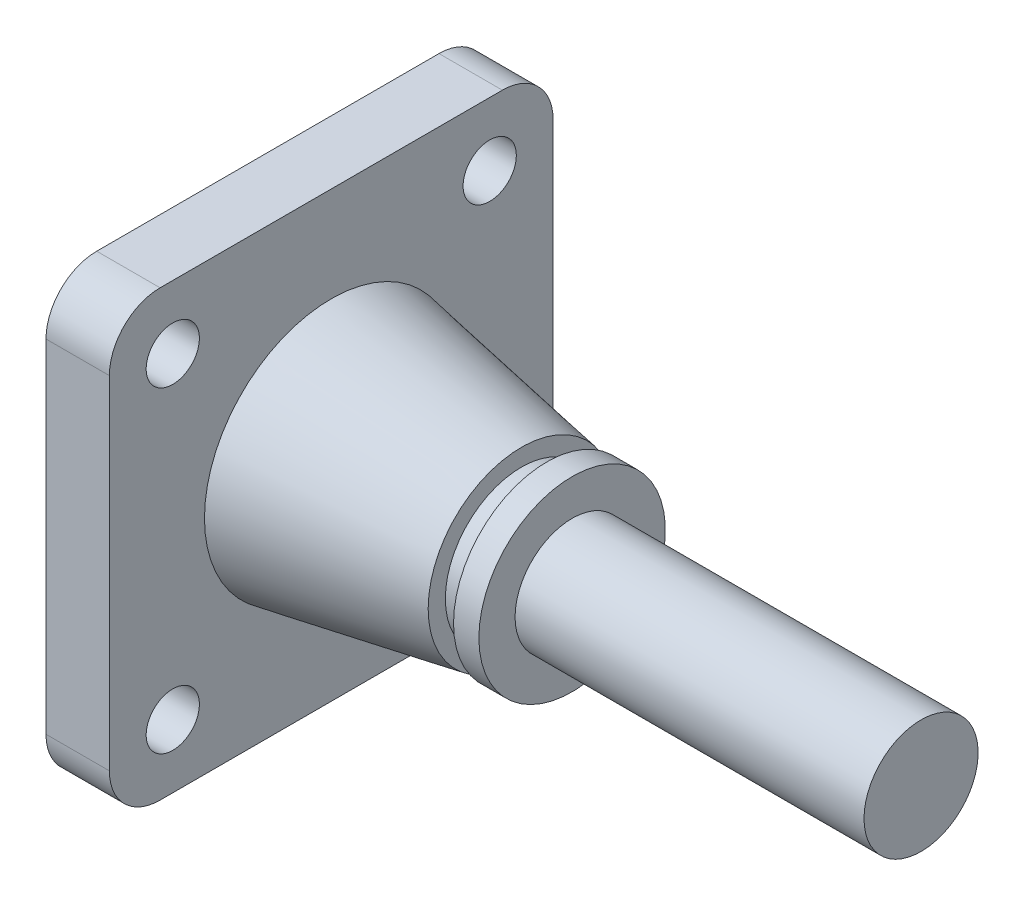
ISO-10303-21;
HEADER;
FILE_DESCRIPTION(('STEP AP214'),'2;1');
FILE_NAME('part.step','',(''),(''),'','','');
FILE_SCHEMA(('AUTOMOTIVE_DESIGN { 1 0 10303 214 1 1 1 1 }'));
ENDSEC;
DATA;
#1=APPLICATION_CONTEXT('core data for automotive mechanical design processes');
#2=APPLICATION_PROTOCOL_DEFINITION('international standard','automotive_design',2000,#1);
#3=PRODUCT_CONTEXT('',#1,'mechanical');
#4=PRODUCT('Part','Part','',(#3));
#5=PRODUCT_RELATED_PRODUCT_CATEGORY('part','',(#4));
#6=PRODUCT_DEFINITION_FORMATION('','',#4);
#7=PRODUCT_DEFINITION_CONTEXT('part definition',#1,'design');
#8=PRODUCT_DEFINITION('design','',#6,#7);
#9=PRODUCT_DEFINITION_SHAPE('','',#8);
#10=(LENGTH_UNIT() NAMED_UNIT(*) SI_UNIT(.MILLI.,.METRE.));
#11=(NAMED_UNIT(*) PLANE_ANGLE_UNIT() SI_UNIT($,.RADIAN.));
#12=(NAMED_UNIT(*) SI_UNIT($,.STERADIAN.) SOLID_ANGLE_UNIT());
#13=UNCERTAINTY_MEASURE_WITH_UNIT(LENGTH_MEASURE(1.E-05),#10,'distance_accuracy_value','');
#14=(GEOMETRIC_REPRESENTATION_CONTEXT(3) GLOBAL_UNCERTAINTY_ASSIGNED_CONTEXT((#13)) GLOBAL_UNIT_ASSIGNED_CONTEXT((#10,
#11,#12)) REPRESENTATION_CONTEXT('',''));
#15=CARTESIAN_POINT('',(0.,0.,0.));
#16=DIRECTION('',(0.,0.,1.));
#17=DIRECTION('',(1.,0.,0.));
#18=AXIS2_PLACEMENT_3D('',#15,#16,#17);
#19=CARTESIAN_POINT('',(5.,0.,-35.));
#20=DIRECTION('',(-1.,0.,0.));
#21=DIRECTION('',(0.,0.,1.));
#22=AXIS2_PLACEMENT_3D('',#19,#20,#21);
#23=PLANE('',#22);
#24=CARTESIAN_POINT('',(5.,-12.5,12.5));
#25=DIRECTION('',(-1.,0.,0.));
#26=DIRECTION('',(0.,0.,1.));
#27=AXIS2_PLACEMENT_3D('',#24,#25,#26);
#28=CIRCLE('',#27,2.1);
#29=CARTESIAN_POINT('',(5.,-12.5,14.6));
#30=VERTEX_POINT('',#29);
#31=EDGE_CURVE('E131',#30,#30,#28,.T.);
#32=ORIENTED_EDGE('',*,*,#31,.T.);
#33=EDGE_LOOP('',(#32));
#34=FACE_BOUND('',#33,.T.);
#35=CARTESIAN_POINT('',(5.,-12.5,-12.5));
#36=DIRECTION('',(-1.,0.,0.));
#37=DIRECTION('',(0.,0.,1.));
#38=AXIS2_PLACEMENT_3D('',#35,#36,#37);
#39=CIRCLE('',#38,2.1);
#40=CARTESIAN_POINT('',(5.,-12.5,-10.4));
#41=VERTEX_POINT('',#40);
#42=EDGE_CURVE('E289',#41,#41,#39,.T.);
#43=ORIENTED_EDGE('',*,*,#42,.T.);
#44=EDGE_LOOP('',(#43));
#45=FACE_BOUND('',#44,.T.);
#46=CARTESIAN_POINT('',(5.,12.5,-12.5));
#47=DIRECTION('',(-1.,0.,0.));
#48=DIRECTION('',(0.,0.,1.));
#49=AXIS2_PLACEMENT_3D('',#46,#47,#48);
#50=CIRCLE('',#49,2.1);
#51=CARTESIAN_POINT('',(5.,12.5,-10.4));
#52=VERTEX_POINT('',#51);
#53=EDGE_CURVE('E288',#52,#52,#50,.T.);
#54=ORIENTED_EDGE('',*,*,#53,.T.);
#55=EDGE_LOOP('',(#54));
#56=FACE_BOUND('',#55,.T.);
#57=CARTESIAN_POINT('',(5.,12.5,12.5));
#58=DIRECTION('',(-1.,0.,0.));
#59=DIRECTION('',(0.,0.,1.));
#60=AXIS2_PLACEMENT_3D('',#57,#58,#59);
#61=CIRCLE('',#60,2.1);
#62=CARTESIAN_POINT('',(5.,12.5,14.6));
#63=VERTEX_POINT('',#62);
#64=EDGE_CURVE('E291',#63,#63,#61,.T.);
#65=ORIENTED_EDGE('',*,*,#64,.T.);
#66=EDGE_LOOP('',(#65));
#67=FACE_BOUND('',#66,.T.);
#68=CARTESIAN_POINT('',(5.,0.,0.));
#69=DIRECTION('',(-1.,0.,0.));
#70=DIRECTION('',(0.,0.,1.));
#71=AXIS2_PLACEMENT_3D('',#68,#69,#70);
#72=CIRCLE('',#71,10.);
#73=CARTESIAN_POINT('',(5.,0.,10.));
#74=VERTEX_POINT('',#73);
#75=EDGE_CURVE('E137',#74,#74,#72,.T.);
#76=ORIENTED_EDGE('',*,*,#75,.T.);
#77=EDGE_LOOP('',(#76));
#78=FACE_BOUND('',#77,.T.);
#79=DIRECTION('',(0.,1.,0.));
#80=VECTOR('',#79,1.);
#81=CARTESIAN_POINT('',(5.,17.5,-17.5));
#82=LINE('',#81,#80);
#83=CARTESIAN_POINT('',(5.,-13.5,-17.5));
#84=VERTEX_POINT('',#83);
#85=CARTESIAN_POINT('',(5.,13.5,-17.5));
#86=VERTEX_POINT('',#85);
#87=EDGE_CURVE('E115',#84,#86,#82,.T.);
#88=ORIENTED_EDGE('',*,*,#87,.T.);
#89=CARTESIAN_POINT('',(5.,13.5,-13.5));
#90=DIRECTION('',(-1.,0.,0.));
#91=DIRECTION('',(0.,0.,1.));
#92=AXIS2_PLACEMENT_3D('',#89,#90,#91);
#93=CIRCLE('',#92,4.);
#94=CARTESIAN_POINT('',(5.,17.5,-13.5));
#95=VERTEX_POINT('',#94);
#96=EDGE_CURVE('E118',#86,#95,#93,.F.);
#97=ORIENTED_EDGE('',*,*,#96,.T.);
#98=DIRECTION('',(0.,0.,1.));
#99=VECTOR('',#98,1.);
#100=CARTESIAN_POINT('',(5.,17.5,17.5));
#101=LINE('',#100,#99);
#102=CARTESIAN_POINT('',(5.,17.5,13.5));
#103=VERTEX_POINT('',#102);
#104=EDGE_CURVE('E128',#95,#103,#101,.T.);
#105=ORIENTED_EDGE('',*,*,#104,.T.);
#106=CARTESIAN_POINT('',(5.,13.5,13.5));
#107=DIRECTION('',(-1.,0.,0.));
#108=DIRECTION('',(0.,0.,1.));
#109=AXIS2_PLACEMENT_3D('',#106,#107,#108);
#110=CIRCLE('',#109,4.);
#111=CARTESIAN_POINT('',(5.,13.5,17.5));
#112=VERTEX_POINT('',#111);
#113=EDGE_CURVE('E140',#103,#112,#110,.F.);
#114=ORIENTED_EDGE('',*,*,#113,.T.);
#115=DIRECTION('',(0.,-1.,0.));
#116=VECTOR('',#115,1.);
#117=CARTESIAN_POINT('',(5.,17.5,17.5));
#118=LINE('',#117,#116);
#119=CARTESIAN_POINT('',(5.,-13.5,17.5));
#120=VERTEX_POINT('',#119);
#121=EDGE_CURVE('E176',#112,#120,#118,.T.);
#122=ORIENTED_EDGE('',*,*,#121,.T.);
#123=CARTESIAN_POINT('',(5.,-13.5,13.5));
#124=DIRECTION('',(-1.,0.,0.));
#125=DIRECTION('',(0.,0.,1.));
#126=AXIS2_PLACEMENT_3D('',#123,#124,#125);
#127=CIRCLE('',#126,4.);
#128=CARTESIAN_POINT('',(5.,-17.5,13.5));
#129=VERTEX_POINT('',#128);
#130=EDGE_CURVE('E119',#120,#129,#127,.F.);
#131=ORIENTED_EDGE('',*,*,#130,.T.);
#132=DIRECTION('',(0.,0.,-1.));
#133=VECTOR('',#132,1.);
#134=CARTESIAN_POINT('',(5.,-17.5,17.5));
#135=LINE('',#134,#133);
#136=CARTESIAN_POINT('',(5.,-17.5,-13.5));
#137=VERTEX_POINT('',#136);
#138=EDGE_CURVE('E111',#129,#137,#135,.T.);
#139=ORIENTED_EDGE('',*,*,#138,.T.);
#140=CARTESIAN_POINT('',(5.,-13.5,-13.5));
#141=DIRECTION('',(-1.,0.,0.));
#142=DIRECTION('',(0.,0.,1.));
#143=AXIS2_PLACEMENT_3D('',#140,#141,#142);
#144=CIRCLE('',#143,4.);
#145=EDGE_CURVE('E109',#137,#84,#144,.F.);
#146=ORIENTED_EDGE('',*,*,#145,.T.);
#147=EDGE_LOOP('',(#88,#97,#105,#114,#122,#131,#139,#146));
#148=FACE_BOUND('',#147,.T.);
#149=ADVANCED_FACE('F42',(#34,#45,#56,#67,#78,#148),#23,.F.);
#150=CARTESIAN_POINT('',(20.,0.,0.));
#151=DIRECTION('',(-1.,0.,0.));
#152=DIRECTION('',(0.,0.,1.));
#153=AXIS2_PLACEMENT_3D('',#150,#151,#152);
#154=CONICAL_SURFACE('',#153,7.35509528937302,0.174532925199433);
#155=ORIENTED_EDGE('',*,*,#75,.F.);
#156=EDGE_LOOP('',(#155));
#157=FACE_BOUND('',#156,.T.);
#158=CARTESIAN_POINT('',(20.,0.,0.));
#159=DIRECTION('',(-1.,0.,0.));
#160=DIRECTION('',(0.,0.,1.));
#161=AXIS2_PLACEMENT_3D('',#158,#159,#160);
#162=CIRCLE('',#161,7.35509528937302);
#163=CARTESIAN_POINT('',(20.,0.,7.35509528937302));
#164=VERTEX_POINT('',#163);
#165=EDGE_CURVE('E143',#164,#164,#162,.T.);
#166=ORIENTED_EDGE('',*,*,#165,.T.);
#167=EDGE_LOOP('',(#166));
#168=FACE_BOUND('',#167,.T.);
#169=ADVANCED_FACE('F199',(#157,#168),#154,.T.);
#170=CARTESIAN_POINT('',(20.,0.,-7.35509528937302));
#171=DIRECTION('',(-1.,0.,0.));
#172=DIRECTION('',(0.,0.,1.));
#173=AXIS2_PLACEMENT_3D('',#170,#171,#172);
#174=PLANE('',#173);
#175=ORIENTED_EDGE('',*,*,#165,.F.);
#176=EDGE_LOOP('',(#175));
#177=FACE_BOUND('',#176,.T.);
#178=CARTESIAN_POINT('',(20.,0.,0.));
#179=DIRECTION('',(-1.,0.,0.));
#180=DIRECTION('',(0.,0.,1.));
#181=AXIS2_PLACEMENT_3D('',#178,#179,#180);
#182=CIRCLE('',#181,6.);
#183=CARTESIAN_POINT('',(20.,0.,6.));
#184=VERTEX_POINT('',#183);
#185=EDGE_CURVE('E193',#184,#184,#182,.T.);
#186=ORIENTED_EDGE('',*,*,#185,.T.);
#187=EDGE_LOOP('',(#186));
#188=FACE_BOUND('',#187,.T.);
#189=ADVANCED_FACE('F205',(#177,#188),#174,.F.);
#190=CARTESIAN_POINT('',(0.,0.,0.));
#191=DIRECTION('',(-1.,0.,0.));
#192=DIRECTION('',(0.,0.,1.));
#193=AXIS2_PLACEMENT_3D('',#190,#191,#192);
#194=CYLINDRICAL_SURFACE('',#193,6.);
#195=ORIENTED_EDGE('',*,*,#185,.F.);
#196=EDGE_LOOP('',(#195));
#197=FACE_BOUND('',#196,.T.);
#198=CARTESIAN_POINT('',(22.,0.,0.));
#199=DIRECTION('',(-1.,0.,0.));
#200=DIRECTION('',(0.,0.,1.));
#201=AXIS2_PLACEMENT_3D('',#198,#199,#200);
#202=CIRCLE('',#201,6.);
#203=CARTESIAN_POINT('',(22.,0.,6.));
#204=VERTEX_POINT('',#203);
#205=EDGE_CURVE('E194',#204,#204,#202,.T.);
#206=ORIENTED_EDGE('',*,*,#205,.T.);
#207=EDGE_LOOP('',(#206));
#208=FACE_BOUND('',#207,.T.);
#209=ADVANCED_FACE('F202',(#197,#208),#194,.T.);
#210=CARTESIAN_POINT('',(22.,0.,-6.));
#211=DIRECTION('',(1.,0.,0.));
#212=DIRECTION('',(0.,0.,-1.));
#213=AXIS2_PLACEMENT_3D('',#210,#211,#212);
#214=PLANE('',#213);
#215=ORIENTED_EDGE('',*,*,#205,.F.);
#216=EDGE_LOOP('',(#215));
#217=FACE_BOUND('',#216,.T.);
#218=CARTESIAN_POINT('',(22.,0.,0.));
#219=DIRECTION('',(-1.,0.,0.));
#220=DIRECTION('',(0.,0.,1.));
#221=AXIS2_PLACEMENT_3D('',#218,#219,#220);
#222=CIRCLE('',#221,7.35509528937302);
#223=CARTESIAN_POINT('',(22.,0.,7.35509528937302));
#224=VERTEX_POINT('',#223);
#225=EDGE_CURVE('E188',#224,#224,#222,.T.);
#226=ORIENTED_EDGE('',*,*,#225,.T.);
#227=EDGE_LOOP('',(#226));
#228=FACE_BOUND('',#227,.T.);
#229=ADVANCED_FACE('F211',(#217,#228),#214,.F.);
#230=CARTESIAN_POINT('',(0.,0.,0.));
#231=DIRECTION('',(-1.,0.,0.));
#232=DIRECTION('',(0.,0.,1.));
#233=AXIS2_PLACEMENT_3D('',#230,#231,#232);
#234=CYLINDRICAL_SURFACE('',#233,7.35509528937302);
#235=ORIENTED_EDGE('',*,*,#225,.F.);
#236=EDGE_LOOP('',(#235));
#237=FACE_BOUND('',#236,.T.);
#238=CARTESIAN_POINT('',(24.,0.,0.));
#239=DIRECTION('',(-1.,0.,0.));
#240=DIRECTION('',(0.,0.,1.));
#241=AXIS2_PLACEMENT_3D('',#238,#239,#240);
#242=CIRCLE('',#241,7.35509528937302);
#243=CARTESIAN_POINT('',(24.,0.,7.35509528937302));
#244=VERTEX_POINT('',#243);
#245=EDGE_CURVE('E186',#244,#244,#242,.T.);
#246=ORIENTED_EDGE('',*,*,#245,.T.);
#247=EDGE_LOOP('',(#246));
#248=FACE_BOUND('',#247,.T.);
#249=ADVANCED_FACE('F220',(#237,#248),#234,.T.);
#250=CARTESIAN_POINT('',(24.,0.,-7.35509528937302));
#251=DIRECTION('',(-1.,0.,0.));
#252=DIRECTION('',(0.,0.,1.));
#253=AXIS2_PLACEMENT_3D('',#250,#251,#252);
#254=PLANE('',#253);
#255=ORIENTED_EDGE('',*,*,#245,.F.);
#256=EDGE_LOOP('',(#255));
#257=FACE_BOUND('',#256,.T.);
#258=CARTESIAN_POINT('',(24.,0.,0.));
#259=DIRECTION('',(-1.,0.,0.));
#260=DIRECTION('',(0.,0.,1.));
#261=AXIS2_PLACEMENT_3D('',#258,#259,#260);
#262=CIRCLE('',#261,4.5);
#263=CARTESIAN_POINT('',(24.,0.,4.5));
#264=VERTEX_POINT('',#263);
#265=EDGE_CURVE('E171',#264,#264,#262,.T.);
#266=ORIENTED_EDGE('',*,*,#265,.T.);
#267=EDGE_LOOP('',(#266));
#268=FACE_BOUND('',#267,.T.);
#269=ADVANCED_FACE('F224',(#257,#268),#254,.F.);
#270=CARTESIAN_POINT('',(0.,0.,0.));
#271=DIRECTION('',(-1.,0.,0.));
#272=DIRECTION('',(0.,0.,1.));
#273=AXIS2_PLACEMENT_3D('',#270,#271,#272);
#274=CYLINDRICAL_SURFACE('',#273,4.5);
#275=ORIENTED_EDGE('',*,*,#265,.F.);
#276=EDGE_LOOP('',(#275));
#277=FACE_BOUND('',#276,.T.);
#278=CARTESIAN_POINT('',(51.5249809067041,0.,0.));
#279=DIRECTION('',(-1.,0.,0.));
#280=DIRECTION('',(0.,0.,1.));
#281=AXIS2_PLACEMENT_3D('',#278,#279,#280);
#282=CIRCLE('',#281,4.5);
#283=CARTESIAN_POINT('',(51.5249809067041,0.,4.5));
#284=VERTEX_POINT('',#283);
#285=EDGE_CURVE('E170',#284,#284,#282,.T.);
#286=ORIENTED_EDGE('',*,*,#285,.T.);
#287=EDGE_LOOP('',(#286));
#288=FACE_BOUND('',#287,.T.);
#289=ADVANCED_FACE('F228',(#277,#288),#274,.T.);
#290=CARTESIAN_POINT('',(51.5249809067041,0.,-4.5));
#291=DIRECTION('',(-1.,0.,0.));
#292=DIRECTION('',(0.,0.,1.));
#293=AXIS2_PLACEMENT_3D('',#290,#291,#292);
#294=PLANE('',#293);
#295=ORIENTED_EDGE('',*,*,#285,.F.);
#296=EDGE_LOOP('',(#295));
#297=FACE_BOUND('',#296,.T.);
#298=ADVANCED_FACE('F233',(#297),#294,.F.);
#299=CARTESIAN_POINT('',(0.,17.5,-17.5));
#300=DIRECTION('',(0.,0.,-1.));
#301=DIRECTION('',(0.,1.,0.));
#302=AXIS2_PLACEMENT_3D('',#299,#300,#301);
#303=PLANE('',#302);
#304=DIRECTION('',(0.,1.,0.));
#305=VECTOR('',#304,1.);
#306=CARTESIAN_POINT('',(0.,17.5,-17.5));
#307=LINE('',#306,#305);
#308=CARTESIAN_POINT('',(0.,-13.5,-17.5));
#309=VERTEX_POINT('',#308);
#310=CARTESIAN_POINT('',(0.,13.5,-17.5));
#311=VERTEX_POINT('',#310);
#312=EDGE_CURVE('E185',#309,#311,#307,.T.);
#313=ORIENTED_EDGE('',*,*,#312,.T.);
#314=DIRECTION('',(1.,0.,0.));
#315=VECTOR('',#314,1.);
#316=CARTESIAN_POINT('',(0.,13.5,-17.5));
#317=LINE('',#316,#315);
#318=EDGE_CURVE('E129',#311,#86,#317,.T.);
#319=ORIENTED_EDGE('',*,*,#318,.T.);
#320=ORIENTED_EDGE('',*,*,#87,.F.);
#321=DIRECTION('',(1.,0.,0.));
#322=VECTOR('',#321,1.);
#323=CARTESIAN_POINT('',(0.,-13.5,-17.5));
#324=LINE('',#323,#322);
#325=EDGE_CURVE('E127',#84,#309,#324,.F.);
#326=ORIENTED_EDGE('',*,*,#325,.T.);
#327=EDGE_LOOP('',(#313,#319,#320,#326));
#328=FACE_BOUND('',#327,.T.);
#329=ADVANCED_FACE('F123',(#328),#303,.T.);
#330=CARTESIAN_POINT('',(0.,-17.5,17.5));
#331=DIRECTION('',(0.,-1.,0.));
#332=DIRECTION('',(0.,0.,-1.));
#333=AXIS2_PLACEMENT_3D('',#330,#331,#332);
#334=PLANE('',#333);
#335=DIRECTION('',(0.,0.,-1.));
#336=VECTOR('',#335,1.);
#337=CARTESIAN_POINT('',(0.,-17.5,17.5));
#338=LINE('',#337,#336);
#339=CARTESIAN_POINT('',(0.,-17.5,13.5));
#340=VERTEX_POINT('',#339);
#341=CARTESIAN_POINT('',(0.,-17.5,-13.5));
#342=VERTEX_POINT('',#341);
#343=EDGE_CURVE('E167',#340,#342,#338,.T.);
#344=ORIENTED_EDGE('',*,*,#343,.T.);
#345=DIRECTION('',(1.,0.,0.));
#346=VECTOR('',#345,1.);
#347=CARTESIAN_POINT('',(0.,-17.5,-13.5));
#348=LINE('',#347,#346);
#349=EDGE_CURVE('E161',#342,#137,#348,.T.);
#350=ORIENTED_EDGE('',*,*,#349,.T.);
#351=ORIENTED_EDGE('',*,*,#138,.F.);
#352=DIRECTION('',(1.,0.,0.));
#353=VECTOR('',#352,1.);
#354=CARTESIAN_POINT('',(0.,-17.5,13.5));
#355=LINE('',#354,#353);
#356=EDGE_CURVE('E157',#129,#340,#355,.F.);
#357=ORIENTED_EDGE('',*,*,#356,.T.);
#358=EDGE_LOOP('',(#344,#350,#351,#357));
#359=FACE_BOUND('',#358,.T.);
#360=ADVANCED_FACE('F163',(#359),#334,.T.);
#361=CARTESIAN_POINT('',(0.,17.5,17.5));
#362=DIRECTION('',(0.,0.,1.));
#363=DIRECTION('',(0.,-1.,0.));
#364=AXIS2_PLACEMENT_3D('',#361,#362,#363);
#365=PLANE('',#364);
#366=DIRECTION('',(0.,-1.,0.));
#367=VECTOR('',#366,1.);
#368=CARTESIAN_POINT('',(0.,17.5,17.5));
#369=LINE('',#368,#367);
#370=CARTESIAN_POINT('',(0.,13.5,17.5));
#371=VERTEX_POINT('',#370);
#372=CARTESIAN_POINT('',(0.,-13.5,17.5));
#373=VERTEX_POINT('',#372);
#374=EDGE_CURVE('E169',#371,#373,#369,.T.);
#375=ORIENTED_EDGE('',*,*,#374,.T.);
#376=DIRECTION('',(1.,0.,0.));
#377=VECTOR('',#376,1.);
#378=CARTESIAN_POINT('',(0.,-13.5,17.5));
#379=LINE('',#378,#377);
#380=EDGE_CURVE('E12',#373,#120,#379,.T.);
#381=ORIENTED_EDGE('',*,*,#380,.T.);
#382=ORIENTED_EDGE('',*,*,#121,.F.);
#383=DIRECTION('',(1.,0.,0.));
#384=VECTOR('',#383,1.);
#385=CARTESIAN_POINT('',(0.,13.5,17.5));
#386=LINE('',#385,#384);
#387=EDGE_CURVE('E55',#112,#371,#386,.F.);
#388=ORIENTED_EDGE('',*,*,#387,.T.);
#389=EDGE_LOOP('',(#375,#381,#382,#388));
#390=FACE_BOUND('',#389,.T.);
#391=ADVANCED_FACE('F274',(#390),#365,.T.);
#392=CARTESIAN_POINT('',(0.,17.5,17.5));
#393=DIRECTION('',(0.,1.,0.));
#394=DIRECTION('',(0.,0.,1.));
#395=AXIS2_PLACEMENT_3D('',#392,#393,#394);
#396=PLANE('',#395);
#397=ORIENTED_EDGE('',*,*,#104,.F.);
#398=DIRECTION('',(1.,0.,0.));
#399=VECTOR('',#398,1.);
#400=CARTESIAN_POINT('',(0.,17.5,-13.5));
#401=LINE('',#400,#399);
#402=CARTESIAN_POINT('',(0.,17.5,-13.5));
#403=VERTEX_POINT('',#402);
#404=EDGE_CURVE('E151',#95,#403,#401,.F.);
#405=ORIENTED_EDGE('',*,*,#404,.T.);
#406=DIRECTION('',(0.,0.,1.));
#407=VECTOR('',#406,1.);
#408=CARTESIAN_POINT('',(0.,17.5,17.5));
#409=LINE('',#408,#407);
#410=CARTESIAN_POINT('',(0.,17.5,13.5));
#411=VERTEX_POINT('',#410);
#412=EDGE_CURVE('E172',#403,#411,#409,.T.);
#413=ORIENTED_EDGE('',*,*,#412,.T.);
#414=DIRECTION('',(1.,0.,0.));
#415=VECTOR('',#414,1.);
#416=CARTESIAN_POINT('',(0.,17.5,13.5));
#417=LINE('',#416,#415);
#418=EDGE_CURVE('E146',#411,#103,#417,.T.);
#419=ORIENTED_EDGE('',*,*,#418,.T.);
#420=EDGE_LOOP('',(#397,#405,#413,#419));
#421=FACE_BOUND('',#420,.T.);
#422=ADVANCED_FACE('F261',(#421),#396,.T.);
#423=CARTESIAN_POINT('',(0.,0.,0.));
#424=DIRECTION('',(1.,0.,0.));
#425=DIRECTION('',(0.,0.,-1.));
#426=AXIS2_PLACEMENT_3D('',#423,#424,#425);
#427=PLANE('',#426);
#428=CARTESIAN_POINT('',(0.,-12.5,12.5));
#429=DIRECTION('',(1.,0.,0.));
#430=DIRECTION('',(0.,0.,-1.));
#431=AXIS2_PLACEMENT_3D('',#428,#429,#430);
#432=CIRCLE('',#431,2.1);
#433=CARTESIAN_POINT('',(0.,-12.5,10.4));
#434=VERTEX_POINT('',#433);
#435=EDGE_CURVE('E299',#434,#434,#432,.T.);
#436=ORIENTED_EDGE('',*,*,#435,.T.);
#437=EDGE_LOOP('',(#436));
#438=FACE_BOUND('',#437,.T.);
#439=CARTESIAN_POINT('',(0.,-12.5,-12.5));
#440=DIRECTION('',(1.,0.,0.));
#441=DIRECTION('',(0.,0.,-1.));
#442=AXIS2_PLACEMENT_3D('',#439,#440,#441);
#443=CIRCLE('',#442,2.1);
#444=CARTESIAN_POINT('',(0.,-12.5,-14.6));
#445=VERTEX_POINT('',#444);
#446=EDGE_CURVE('E305',#445,#445,#443,.T.);
#447=ORIENTED_EDGE('',*,*,#446,.T.);
#448=EDGE_LOOP('',(#447));
#449=FACE_BOUND('',#448,.T.);
#450=CARTESIAN_POINT('',(0.,12.5,-12.5));
#451=DIRECTION('',(1.,0.,0.));
#452=DIRECTION('',(0.,0.,-1.));
#453=AXIS2_PLACEMENT_3D('',#450,#451,#452);
#454=CIRCLE('',#453,2.1);
#455=CARTESIAN_POINT('',(0.,12.5,-14.6));
#456=VERTEX_POINT('',#455);
#457=EDGE_CURVE('E298',#456,#456,#454,.T.);
#458=ORIENTED_EDGE('',*,*,#457,.T.);
#459=EDGE_LOOP('',(#458));
#460=FACE_BOUND('',#459,.T.);
#461=CARTESIAN_POINT('',(0.,12.5,12.5));
#462=DIRECTION('',(1.,0.,0.));
#463=DIRECTION('',(0.,0.,-1.));
#464=AXIS2_PLACEMENT_3D('',#461,#462,#463);
#465=CIRCLE('',#464,2.1);
#466=CARTESIAN_POINT('',(0.,12.5,10.4));
#467=VERTEX_POINT('',#466);
#468=EDGE_CURVE('E296',#467,#467,#465,.T.);
#469=ORIENTED_EDGE('',*,*,#468,.T.);
#470=EDGE_LOOP('',(#469));
#471=FACE_BOUND('',#470,.T.);
#472=ORIENTED_EDGE('',*,*,#412,.F.);
#473=CARTESIAN_POINT('',(0.,13.5,-13.5));
#474=DIRECTION('',(1.,0.,0.));
#475=DIRECTION('',(0.,0.,-1.));
#476=AXIS2_PLACEMENT_3D('',#473,#474,#475);
#477=CIRCLE('',#476,4.);
#478=EDGE_CURVE('E160',#403,#311,#477,.F.);
#479=ORIENTED_EDGE('',*,*,#478,.T.);
#480=ORIENTED_EDGE('',*,*,#312,.F.);
#481=CARTESIAN_POINT('',(0.,-13.5,-13.5));
#482=DIRECTION('',(1.,0.,0.));
#483=DIRECTION('',(0.,0.,-1.));
#484=AXIS2_PLACEMENT_3D('',#481,#482,#483);
#485=CIRCLE('',#484,4.);
#486=EDGE_CURVE('E134',#309,#342,#485,.F.);
#487=ORIENTED_EDGE('',*,*,#486,.T.);
#488=ORIENTED_EDGE('',*,*,#343,.F.);
#489=CARTESIAN_POINT('',(0.,-13.5,13.5));
#490=DIRECTION('',(1.,0.,0.));
#491=DIRECTION('',(0.,0.,-1.));
#492=AXIS2_PLACEMENT_3D('',#489,#490,#491);
#493=CIRCLE('',#492,4.);
#494=EDGE_CURVE('E56',#340,#373,#493,.F.);
#495=ORIENTED_EDGE('',*,*,#494,.T.);
#496=ORIENTED_EDGE('',*,*,#374,.F.);
#497=CARTESIAN_POINT('',(0.,13.5,13.5));
#498=DIRECTION('',(1.,0.,0.));
#499=DIRECTION('',(0.,0.,-1.));
#500=AXIS2_PLACEMENT_3D('',#497,#498,#499);
#501=CIRCLE('',#500,4.);
#502=EDGE_CURVE('E153',#371,#411,#501,.F.);
#503=ORIENTED_EDGE('',*,*,#502,.T.);
#504=EDGE_LOOP('',(#472,#479,#480,#487,#488,#495,#496,#503));
#505=FACE_BOUND('',#504,.T.);
#506=ADVANCED_FACE('F256',(#438,#449,#460,#471,#505),#427,.F.);
#507=CARTESIAN_POINT('',(0.,13.5,-13.5));
#508=DIRECTION('',(1.,0.,0.));
#509=DIRECTION('',(0.,0.,-1.));
#510=AXIS2_PLACEMENT_3D('',#507,#508,#509);
#511=CYLINDRICAL_SURFACE('',#510,4.);
#512=ORIENTED_EDGE('',*,*,#478,.F.);
#513=ORIENTED_EDGE('',*,*,#404,.F.);
#514=ORIENTED_EDGE('',*,*,#96,.F.);
#515=ORIENTED_EDGE('',*,*,#318,.F.);
#516=EDGE_LOOP('',(#512,#513,#514,#515));
#517=FACE_BOUND('',#516,.T.);
#518=ADVANCED_FACE('F257',(#517),#511,.T.);
#519=CARTESIAN_POINT('',(0.,-13.5,-13.5));
#520=DIRECTION('',(1.,0.,0.));
#521=DIRECTION('',(0.,0.,-1.));
#522=AXIS2_PLACEMENT_3D('',#519,#520,#521);
#523=CYLINDRICAL_SURFACE('',#522,4.);
#524=ORIENTED_EDGE('',*,*,#486,.F.);
#525=ORIENTED_EDGE('',*,*,#325,.F.);
#526=ORIENTED_EDGE('',*,*,#145,.F.);
#527=ORIENTED_EDGE('',*,*,#349,.F.);
#528=EDGE_LOOP('',(#524,#525,#526,#527));
#529=FACE_BOUND('',#528,.T.);
#530=ADVANCED_FACE('F133',(#529),#523,.T.);
#531=CARTESIAN_POINT('',(0.,-13.5,13.5));
#532=DIRECTION('',(1.,0.,0.));
#533=DIRECTION('',(0.,0.,-1.));
#534=AXIS2_PLACEMENT_3D('',#531,#532,#533);
#535=CYLINDRICAL_SURFACE('',#534,4.);
#536=ORIENTED_EDGE('',*,*,#494,.F.);
#537=ORIENTED_EDGE('',*,*,#356,.F.);
#538=ORIENTED_EDGE('',*,*,#130,.F.);
#539=ORIENTED_EDGE('',*,*,#380,.F.);
#540=EDGE_LOOP('',(#536,#537,#538,#539));
#541=FACE_BOUND('',#540,.T.);
#542=ADVANCED_FACE('F270',(#541),#535,.T.);
#543=CARTESIAN_POINT('',(0.,13.5,13.5));
#544=DIRECTION('',(1.,0.,0.));
#545=DIRECTION('',(0.,0.,-1.));
#546=AXIS2_PLACEMENT_3D('',#543,#544,#545);
#547=CYLINDRICAL_SURFACE('',#546,4.);
#548=ORIENTED_EDGE('',*,*,#502,.F.);
#549=ORIENTED_EDGE('',*,*,#387,.F.);
#550=ORIENTED_EDGE('',*,*,#113,.F.);
#551=ORIENTED_EDGE('',*,*,#418,.F.);
#552=EDGE_LOOP('',(#548,#549,#550,#551));
#553=FACE_BOUND('',#552,.T.);
#554=ADVANCED_FACE('F46',(#553),#547,.T.);
#555=CARTESIAN_POINT('',(0.,12.5,12.5));
#556=DIRECTION('',(1.,0.,0.));
#557=DIRECTION('',(0.,0.,-1.));
#558=AXIS2_PLACEMENT_3D('',#555,#556,#557);
#559=CYLINDRICAL_SURFACE('',#558,2.1);
#560=ORIENTED_EDGE('',*,*,#468,.F.);
#561=EDGE_LOOP('',(#560));
#562=FACE_BOUND('',#561,.T.);
#563=ORIENTED_EDGE('',*,*,#64,.F.);
#564=EDGE_LOOP('',(#563));
#565=FACE_BOUND('',#564,.T.);
#566=ADVANCED_FACE('F275',(#562,#565),#559,.F.);
#567=CARTESIAN_POINT('',(0.,12.5,-12.5));
#568=DIRECTION('',(1.,0.,0.));
#569=DIRECTION('',(0.,0.,-1.));
#570=AXIS2_PLACEMENT_3D('',#567,#568,#569);
#571=CYLINDRICAL_SURFACE('',#570,2.1);
#572=ORIENTED_EDGE('',*,*,#457,.F.);
#573=EDGE_LOOP('',(#572));
#574=FACE_BOUND('',#573,.T.);
#575=ORIENTED_EDGE('',*,*,#53,.F.);
#576=EDGE_LOOP('',(#575));
#577=FACE_BOUND('',#576,.T.);
#578=ADVANCED_FACE('F313',(#574,#577),#571,.F.);
#579=CARTESIAN_POINT('',(0.,-12.5,-12.5));
#580=DIRECTION('',(1.,0.,0.));
#581=DIRECTION('',(0.,0.,-1.));
#582=AXIS2_PLACEMENT_3D('',#579,#580,#581);
#583=CYLINDRICAL_SURFACE('',#582,2.1);
#584=ORIENTED_EDGE('',*,*,#446,.F.);
#585=EDGE_LOOP('',(#584));
#586=FACE_BOUND('',#585,.T.);
#587=ORIENTED_EDGE('',*,*,#42,.F.);
#588=EDGE_LOOP('',(#587));
#589=FACE_BOUND('',#588,.T.);
#590=ADVANCED_FACE('F314',(#586,#589),#583,.F.);
#591=CARTESIAN_POINT('',(0.,-12.5,12.5));
#592=DIRECTION('',(1.,0.,0.));
#593=DIRECTION('',(0.,0.,-1.));
#594=AXIS2_PLACEMENT_3D('',#591,#592,#593);
#595=CYLINDRICAL_SURFACE('',#594,2.1);
#596=ORIENTED_EDGE('',*,*,#435,.F.);
#597=EDGE_LOOP('',(#596));
#598=FACE_BOUND('',#597,.T.);
#599=ORIENTED_EDGE('',*,*,#31,.F.);
#600=EDGE_LOOP('',(#599));
#601=FACE_BOUND('',#600,.T.);
#602=ADVANCED_FACE('F332',(#598,#601),#595,.F.);
#603=CLOSED_SHELL('',(#149,#169,#189,#209,#229,#249,#269,#289,#298,#329,#360,#391,#422,#506,
#518,#530,#542,#554,#566,#578,#590,#602));
#604=MANIFOLD_SOLID_BREP('B2',#603);
#605=ADVANCED_BREP_SHAPE_REPRESENTATION('',(#18,#604),#14);
#606=SHAPE_DEFINITION_REPRESENTATION(#9,#605);
ENDSEC;
END-ISO-10303-21;
